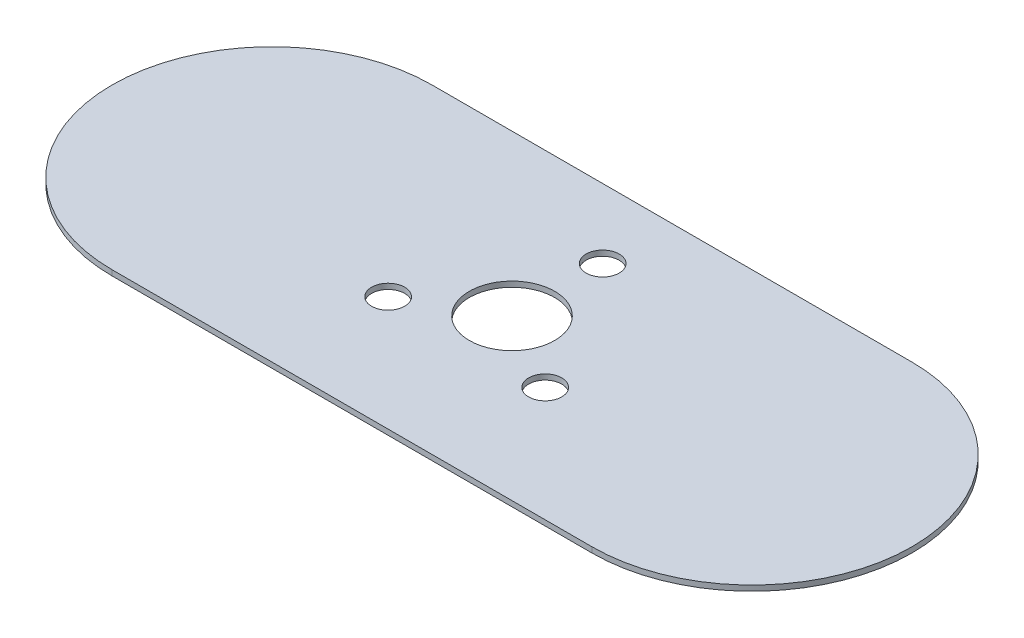
ISO-10303-21;
HEADER;
FILE_DESCRIPTION(('STEP AP214'),'2;1');
FILE_NAME('part.step','',(''),(''),'','','');
FILE_SCHEMA(('AUTOMOTIVE_DESIGN { 1 0 10303 214 1 1 1 1 }'));
ENDSEC;
DATA;
#1=APPLICATION_CONTEXT('core data for automotive mechanical design processes');
#2=APPLICATION_PROTOCOL_DEFINITION('international standard','automotive_design',2000,#1);
#3=PRODUCT_CONTEXT('',#1,'mechanical');
#4=PRODUCT('Part','Part','',(#3));
#5=PRODUCT_RELATED_PRODUCT_CATEGORY('part','',(#4));
#6=PRODUCT_DEFINITION_FORMATION('','',#4);
#7=PRODUCT_DEFINITION_CONTEXT('part definition',#1,'design');
#8=PRODUCT_DEFINITION('design','',#6,#7);
#9=PRODUCT_DEFINITION_SHAPE('','',#8);
#10=(LENGTH_UNIT() NAMED_UNIT(*) SI_UNIT(.MILLI.,.METRE.));
#11=(NAMED_UNIT(*) PLANE_ANGLE_UNIT() SI_UNIT($,.RADIAN.));
#12=(NAMED_UNIT(*) SI_UNIT($,.STERADIAN.) SOLID_ANGLE_UNIT());
#13=UNCERTAINTY_MEASURE_WITH_UNIT(LENGTH_MEASURE(1.E-05),#10,'distance_accuracy_value','');
#14=(GEOMETRIC_REPRESENTATION_CONTEXT(3) GLOBAL_UNCERTAINTY_ASSIGNED_CONTEXT((#13)) GLOBAL_UNIT_ASSIGNED_CONTEXT((#10,
#11,#12)) REPRESENTATION_CONTEXT('',''));
#15=CARTESIAN_POINT('',(0.,0.,0.));
#16=DIRECTION('',(0.,0.,1.));
#17=DIRECTION('',(1.,0.,0.));
#18=AXIS2_PLACEMENT_3D('',#15,#16,#17);
#19=CARTESIAN_POINT('',(-22.5,0.508,-15.));
#20=DIRECTION('',(0.,0.,-1.));
#21=DIRECTION('',(-1.,0.,0.));
#22=AXIS2_PLACEMENT_3D('',#19,#20,#21);
#23=PLANE('',#22);
#24=DIRECTION('',(1.,0.,0.));
#25=VECTOR('',#24,1.);
#26=CARTESIAN_POINT('',(-22.5,0.,-15.));
#27=LINE('',#26,#25);
#28=CARTESIAN_POINT('',(-22.5,0.,-15.));
#29=VERTEX_POINT('',#28);
#30=CARTESIAN_POINT('',(22.5,0.,-15.));
#31=VERTEX_POINT('',#30);
#32=EDGE_CURVE('E101',#29,#31,#27,.T.);
#33=ORIENTED_EDGE('',*,*,#32,.F.);
#34=DIRECTION('',(0.,-1.,0.));
#35=VECTOR('',#34,1.);
#36=CARTESIAN_POINT('',(-22.5,0.508,-15.));
#37=LINE('',#36,#35);
#38=CARTESIAN_POINT('',(-22.5,0.508,-15.));
#39=VERTEX_POINT('',#38);
#40=EDGE_CURVE('E11',#39,#29,#37,.T.);
#41=ORIENTED_EDGE('',*,*,#40,.F.);
#42=DIRECTION('',(1.,0.,0.));
#43=VECTOR('',#42,1.);
#44=CARTESIAN_POINT('',(-22.5,0.508,-15.));
#45=LINE('',#44,#43);
#46=CARTESIAN_POINT('',(22.5,0.508,-15.));
#47=VERTEX_POINT('',#46);
#48=EDGE_CURVE('E95',#39,#47,#45,.T.);
#49=ORIENTED_EDGE('',*,*,#48,.T.);
#50=DIRECTION('',(0.,-1.,0.));
#51=VECTOR('',#50,1.);
#52=CARTESIAN_POINT('',(22.5,0.508,-15.));
#53=LINE('',#52,#51);
#54=EDGE_CURVE('E92',#47,#31,#53,.T.);
#55=ORIENTED_EDGE('',*,*,#54,.T.);
#56=EDGE_LOOP('',(#33,#41,#49,#55));
#57=FACE_BOUND('',#56,.T.);
#58=ADVANCED_FACE('F33',(#57),#23,.T.);
#59=CARTESIAN_POINT('',(-22.5,0.508,0.));
#60=DIRECTION('',(0.,-1.,0.));
#61=DIRECTION('',(0.,0.,-1.));
#62=AXIS2_PLACEMENT_3D('',#59,#60,#61);
#63=CYLINDRICAL_SURFACE('',#62,15.);
#64=CARTESIAN_POINT('',(-22.5,0.,0.));
#65=DIRECTION('',(0.,1.,0.));
#66=DIRECTION('',(0.,0.,1.));
#67=AXIS2_PLACEMENT_3D('',#64,#65,#66);
#68=CIRCLE('',#67,15.);
#69=CARTESIAN_POINT('',(-22.5,0.,15.));
#70=VERTEX_POINT('',#69);
#71=EDGE_CURVE('E66',#29,#70,#68,.T.);
#72=ORIENTED_EDGE('',*,*,#71,.T.);
#73=DIRECTION('',(0.,-1.,0.));
#74=VECTOR('',#73,1.);
#75=CARTESIAN_POINT('',(-22.5,0.508,15.));
#76=LINE('',#75,#74);
#77=CARTESIAN_POINT('',(-22.5,0.508,15.));
#78=VERTEX_POINT('',#77);
#79=EDGE_CURVE('E42',#78,#70,#76,.T.);
#80=ORIENTED_EDGE('',*,*,#79,.F.);
#81=CARTESIAN_POINT('',(-22.5,0.508,0.));
#82=DIRECTION('',(0.,1.,0.));
#83=DIRECTION('',(0.,0.,1.));
#84=AXIS2_PLACEMENT_3D('',#81,#82,#83);
#85=CIRCLE('',#84,15.);
#86=EDGE_CURVE('E81',#39,#78,#85,.T.);
#87=ORIENTED_EDGE('',*,*,#86,.F.);
#88=ORIENTED_EDGE('',*,*,#40,.T.);
#89=EDGE_LOOP('',(#72,#80,#87,#88));
#90=FACE_BOUND('',#89,.T.);
#91=ADVANCED_FACE('F161',(#90),#63,.T.);
#92=CARTESIAN_POINT('',(-22.5,0.508,15.));
#93=DIRECTION('',(0.,0.,-1.));
#94=DIRECTION('',(-1.,0.,0.));
#95=AXIS2_PLACEMENT_3D('',#92,#93,#94);
#96=PLANE('',#95);
#97=DIRECTION('',(1.,0.,0.));
#98=VECTOR('',#97,1.);
#99=CARTESIAN_POINT('',(-22.5,0.,15.));
#100=LINE('',#99,#98);
#101=CARTESIAN_POINT('',(22.5,0.,15.));
#102=VERTEX_POINT('',#101);
#103=EDGE_CURVE('E88',#70,#102,#100,.T.);
#104=ORIENTED_EDGE('',*,*,#103,.T.);
#105=DIRECTION('',(0.,-1.,0.));
#106=VECTOR('',#105,1.);
#107=CARTESIAN_POINT('',(22.5,0.508,15.));
#108=LINE('',#107,#106);
#109=CARTESIAN_POINT('',(22.5,0.508,15.));
#110=VERTEX_POINT('',#109);
#111=EDGE_CURVE('E85',#110,#102,#108,.T.);
#112=ORIENTED_EDGE('',*,*,#111,.F.);
#113=DIRECTION('',(1.,0.,0.));
#114=VECTOR('',#113,1.);
#115=CARTESIAN_POINT('',(-22.5,0.508,15.));
#116=LINE('',#115,#114);
#117=EDGE_CURVE('E78',#78,#110,#116,.T.);
#118=ORIENTED_EDGE('',*,*,#117,.F.);
#119=ORIENTED_EDGE('',*,*,#79,.T.);
#120=EDGE_LOOP('',(#104,#112,#118,#119));
#121=FACE_BOUND('',#120,.T.);
#122=ADVANCED_FACE('F86',(#121),#96,.F.);
#123=CARTESIAN_POINT('',(22.5,0.508,0.));
#124=DIRECTION('',(0.,-1.,0.));
#125=DIRECTION('',(0.,0.,-1.));
#126=AXIS2_PLACEMENT_3D('',#123,#124,#125);
#127=CYLINDRICAL_SURFACE('',#126,15.);
#128=CARTESIAN_POINT('',(22.5,0.,0.));
#129=DIRECTION('',(0.,1.,0.));
#130=DIRECTION('',(0.,0.,1.));
#131=AXIS2_PLACEMENT_3D('',#128,#129,#130);
#132=CIRCLE('',#131,15.);
#133=EDGE_CURVE('E104',#102,#31,#132,.T.);
#134=ORIENTED_EDGE('',*,*,#133,.T.);
#135=ORIENTED_EDGE('',*,*,#54,.F.);
#136=CARTESIAN_POINT('',(22.5,0.508,0.));
#137=DIRECTION('',(0.,1.,0.));
#138=DIRECTION('',(0.,0.,1.));
#139=AXIS2_PLACEMENT_3D('',#136,#137,#138);
#140=CIRCLE('',#139,15.);
#141=EDGE_CURVE('E75',#110,#47,#140,.T.);
#142=ORIENTED_EDGE('',*,*,#141,.F.);
#143=ORIENTED_EDGE('',*,*,#111,.T.);
#144=EDGE_LOOP('',(#134,#135,#142,#143));
#145=FACE_BOUND('',#144,.T.);
#146=ADVANCED_FACE('F94',(#145),#127,.T.);
#147=CARTESIAN_POINT('',(22.5,0.508,0.));
#148=DIRECTION('',(0.,1.,0.));
#149=DIRECTION('',(0.,0.,1.));
#150=AXIS2_PLACEMENT_3D('',#147,#148,#149);
#151=PLANE('',#150);
#152=CARTESIAN_POINT('',(-7.36121593216719,0.508,4.25000000000032));
#153=DIRECTION('',(0.,1.,0.));
#154=DIRECTION('',(0.,0.,1.));
#155=AXIS2_PLACEMENT_3D('',#152,#153,#154);
#156=CIRCLE('',#155,1.55000000000069);
#157=CARTESIAN_POINT('',(-7.36121593216719,0.508,5.800000000001));
#158=VERTEX_POINT('',#157);
#159=EDGE_CURVE('E131',#158,#158,#156,.T.);
#160=ORIENTED_EDGE('',*,*,#159,.F.);
#161=EDGE_LOOP('',(#160));
#162=FACE_BOUND('',#161,.T.);
#163=CARTESIAN_POINT('',(7.36121593216827,0.508,4.24999999999969));
#164=DIRECTION('',(0.,1.,0.));
#165=DIRECTION('',(0.,0.,1.));
#166=AXIS2_PLACEMENT_3D('',#163,#164,#165);
#167=CIRCLE('',#166,1.55000000000046);
#168=CARTESIAN_POINT('',(7.36121593216827,0.508,5.80000000000015));
#169=VERTEX_POINT('',#168);
#170=EDGE_CURVE('E130',#169,#169,#167,.T.);
#171=ORIENTED_EDGE('',*,*,#170,.F.);
#172=EDGE_LOOP('',(#171));
#173=FACE_BOUND('',#172,.T.);
#174=CARTESIAN_POINT('',(0.,0.508,0.));
#175=DIRECTION('',(0.,1.,0.));
#176=DIRECTION('',(0.,0.,1.));
#177=AXIS2_PLACEMENT_3D('',#174,#175,#176);
#178=CIRCLE('',#177,4.);
#179=CARTESIAN_POINT('',(0.,0.508,4.));
#180=VERTEX_POINT('',#179);
#181=EDGE_CURVE('E117',#180,#180,#178,.T.);
#182=ORIENTED_EDGE('',*,*,#181,.F.);
#183=EDGE_LOOP('',(#182));
#184=FACE_BOUND('',#183,.T.);
#185=CARTESIAN_POINT('',(0.,0.508,-8.5));
#186=DIRECTION('',(0.,1.,0.));
#187=DIRECTION('',(0.,0.,1.));
#188=AXIS2_PLACEMENT_3D('',#185,#186,#187);
#189=CIRCLE('',#188,1.55);
#190=CARTESIAN_POINT('',(0.,0.508,-6.95));
#191=VERTEX_POINT('',#190);
#192=EDGE_CURVE('E113',#191,#191,#189,.T.);
#193=ORIENTED_EDGE('',*,*,#192,.F.);
#194=EDGE_LOOP('',(#193));
#195=FACE_BOUND('',#194,.T.);
#196=ORIENTED_EDGE('',*,*,#48,.F.);
#197=ORIENTED_EDGE('',*,*,#86,.T.);
#198=ORIENTED_EDGE('',*,*,#117,.T.);
#199=ORIENTED_EDGE('',*,*,#141,.T.);
#200=EDGE_LOOP('',(#196,#197,#198,#199));
#201=FACE_BOUND('',#200,.T.);
#202=ADVANCED_FACE('F80',(#162,#173,#184,#195,#201),#151,.T.);
#203=CARTESIAN_POINT('',(22.5,0.,0.));
#204=DIRECTION('',(0.,1.,0.));
#205=DIRECTION('',(0.,0.,1.));
#206=AXIS2_PLACEMENT_3D('',#203,#204,#205);
#207=PLANE('',#206);
#208=CARTESIAN_POINT('',(-7.36121593216719,0.,4.25000000000032));
#209=DIRECTION('',(0.,1.,0.));
#210=DIRECTION('',(0.,0.,1.));
#211=AXIS2_PLACEMENT_3D('',#208,#209,#210);
#212=CIRCLE('',#211,1.55000000000069);
#213=CARTESIAN_POINT('',(-7.36121593216719,0.,5.800000000001));
#214=VERTEX_POINT('',#213);
#215=EDGE_CURVE('E36',#214,#214,#212,.T.);
#216=ORIENTED_EDGE('',*,*,#215,.T.);
#217=EDGE_LOOP('',(#216));
#218=FACE_BOUND('',#217,.T.);
#219=CARTESIAN_POINT('',(7.36121593216827,0.,4.24999999999969));
#220=DIRECTION('',(0.,1.,0.));
#221=DIRECTION('',(0.,0.,1.));
#222=AXIS2_PLACEMENT_3D('',#219,#220,#221);
#223=CIRCLE('',#222,1.55000000000046);
#224=CARTESIAN_POINT('',(7.36121593216827,0.,5.80000000000015));
#225=VERTEX_POINT('',#224);
#226=EDGE_CURVE('E116',#225,#225,#223,.T.);
#227=ORIENTED_EDGE('',*,*,#226,.T.);
#228=EDGE_LOOP('',(#227));
#229=FACE_BOUND('',#228,.T.);
#230=CARTESIAN_POINT('',(0.,0.,0.));
#231=DIRECTION('',(0.,1.,0.));
#232=DIRECTION('',(0.,0.,1.));
#233=AXIS2_PLACEMENT_3D('',#230,#231,#232);
#234=CIRCLE('',#233,4.);
#235=CARTESIAN_POINT('',(0.,0.,4.));
#236=VERTEX_POINT('',#235);
#237=EDGE_CURVE('E114',#236,#236,#234,.T.);
#238=ORIENTED_EDGE('',*,*,#237,.T.);
#239=EDGE_LOOP('',(#238));
#240=FACE_BOUND('',#239,.T.);
#241=CARTESIAN_POINT('',(0.,0.,-8.5));
#242=DIRECTION('',(0.,1.,0.));
#243=DIRECTION('',(0.,0.,1.));
#244=AXIS2_PLACEMENT_3D('',#241,#242,#243);
#245=CIRCLE('',#244,1.55);
#246=CARTESIAN_POINT('',(0.,0.,-6.95));
#247=VERTEX_POINT('',#246);
#248=EDGE_CURVE('E105',#247,#247,#245,.T.);
#249=ORIENTED_EDGE('',*,*,#248,.T.);
#250=EDGE_LOOP('',(#249));
#251=FACE_BOUND('',#250,.T.);
#252=ORIENTED_EDGE('',*,*,#32,.T.);
#253=ORIENTED_EDGE('',*,*,#133,.F.);
#254=ORIENTED_EDGE('',*,*,#103,.F.);
#255=ORIENTED_EDGE('',*,*,#71,.F.);
#256=EDGE_LOOP('',(#252,#253,#254,#255));
#257=FACE_BOUND('',#256,.T.);
#258=ADVANCED_FACE('F142',(#218,#229,#240,#251,#257),#207,.F.);
#259=CARTESIAN_POINT('',(0.,-1.092,-8.5));
#260=DIRECTION('',(0.,1.,0.));
#261=DIRECTION('',(0.,0.,1.));
#262=AXIS2_PLACEMENT_3D('',#259,#260,#261);
#263=CYLINDRICAL_SURFACE('',#262,1.55);
#264=ORIENTED_EDGE('',*,*,#192,.T.);
#265=EDGE_LOOP('',(#264));
#266=FACE_BOUND('',#265,.T.);
#267=ORIENTED_EDGE('',*,*,#248,.F.);
#268=EDGE_LOOP('',(#267));
#269=FACE_BOUND('',#268,.T.);
#270=ADVANCED_FACE('F151',(#266,#269),#263,.F.);
#271=CARTESIAN_POINT('',(0.,-1.092,0.));
#272=DIRECTION('',(0.,1.,0.));
#273=DIRECTION('',(0.,0.,1.));
#274=AXIS2_PLACEMENT_3D('',#271,#272,#273);
#275=CYLINDRICAL_SURFACE('',#274,4.);
#276=ORIENTED_EDGE('',*,*,#181,.T.);
#277=EDGE_LOOP('',(#276));
#278=FACE_BOUND('',#277,.T.);
#279=ORIENTED_EDGE('',*,*,#237,.F.);
#280=EDGE_LOOP('',(#279));
#281=FACE_BOUND('',#280,.T.);
#282=ADVANCED_FACE('F148',(#278,#281),#275,.F.);
#283=CARTESIAN_POINT('',(7.36121593216827,-1.092,4.24999999999969));
#284=DIRECTION('',(0.,1.,0.));
#285=DIRECTION('',(0.,0.,1.));
#286=AXIS2_PLACEMENT_3D('',#283,#284,#285);
#287=CYLINDRICAL_SURFACE('',#286,1.55000000000046);
#288=ORIENTED_EDGE('',*,*,#170,.T.);
#289=EDGE_LOOP('',(#288));
#290=FACE_BOUND('',#289,.T.);
#291=ORIENTED_EDGE('',*,*,#226,.F.);
#292=EDGE_LOOP('',(#291));
#293=FACE_BOUND('',#292,.T.);
#294=ADVANCED_FACE('F137',(#290,#293),#287,.F.);
#295=CARTESIAN_POINT('',(-7.36121593216719,-1.092,4.25000000000032));
#296=DIRECTION('',(0.,1.,0.));
#297=DIRECTION('',(0.,0.,1.));
#298=AXIS2_PLACEMENT_3D('',#295,#296,#297);
#299=CYLINDRICAL_SURFACE('',#298,1.55000000000069);
#300=ORIENTED_EDGE('',*,*,#159,.T.);
#301=EDGE_LOOP('',(#300));
#302=FACE_BOUND('',#301,.T.);
#303=ORIENTED_EDGE('',*,*,#215,.F.);
#304=EDGE_LOOP('',(#303));
#305=FACE_BOUND('',#304,.T.);
#306=ADVANCED_FACE('F199',(#302,#305),#299,.F.);
#307=CLOSED_SHELL('',(#58,#91,#122,#146,#202,#258,#270,#282,#294,#306));
#308=MANIFOLD_SOLID_BREP('B2',#307);
#309=ADVANCED_BREP_SHAPE_REPRESENTATION('',(#18,#308),#14);
#310=SHAPE_DEFINITION_REPRESENTATION(#9,#309);
ENDSEC;
END-ISO-10303-21;
